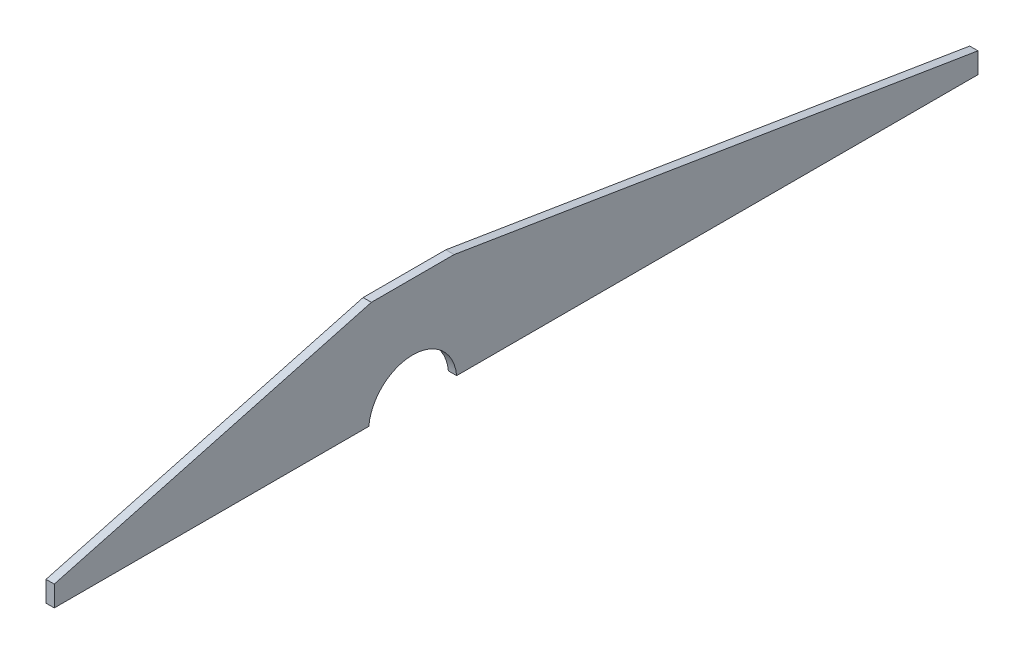
ISO-10303-21;
HEADER;
FILE_DESCRIPTION(('STEP AP214'),'2;1');
FILE_NAME('part.step','',(''),(''),'','','');
FILE_SCHEMA(('AUTOMOTIVE_DESIGN { 1 0 10303 214 1 1 1 1 }'));
ENDSEC;
DATA;
#1=APPLICATION_CONTEXT('core data for automotive mechanical design processes');
#2=APPLICATION_PROTOCOL_DEFINITION('international standard','automotive_design',2000,#1);
#3=PRODUCT_CONTEXT('',#1,'mechanical');
#4=PRODUCT('Part','Part','',(#3));
#5=PRODUCT_RELATED_PRODUCT_CATEGORY('part','',(#4));
#6=PRODUCT_DEFINITION_FORMATION('','',#4);
#7=PRODUCT_DEFINITION_CONTEXT('part definition',#1,'design');
#8=PRODUCT_DEFINITION('design','',#6,#7);
#9=PRODUCT_DEFINITION_SHAPE('','',#8);
#10=(LENGTH_UNIT() NAMED_UNIT(*) SI_UNIT(.MILLI.,.METRE.));
#11=(NAMED_UNIT(*) PLANE_ANGLE_UNIT() SI_UNIT($,.RADIAN.));
#12=(NAMED_UNIT(*) SI_UNIT($,.STERADIAN.) SOLID_ANGLE_UNIT());
#13=UNCERTAINTY_MEASURE_WITH_UNIT(LENGTH_MEASURE(1.E-05),#10,'distance_accuracy_value','');
#14=(GEOMETRIC_REPRESENTATION_CONTEXT(3) GLOBAL_UNCERTAINTY_ASSIGNED_CONTEXT((#13)) GLOBAL_UNIT_ASSIGNED_CONTEXT((#10,
#11,#12)) REPRESENTATION_CONTEXT('',''));
#15=CARTESIAN_POINT('',(0.,0.,0.));
#16=DIRECTION('',(0.,0.,1.));
#17=DIRECTION('',(1.,0.,0.));
#18=AXIS2_PLACEMENT_3D('',#15,#16,#17);
#19=CARTESIAN_POINT('',(-6.00000000000001,1.11022302462516E-13,-3.33066907387547E-13));
#20=DIRECTION('',(1.,0.,0.));
#21=DIRECTION('',(0.,0.,-1.00000000000002));
#22=AXIS2_PLACEMENT_3D('',#19,#20,#21);
#23=CYLINDRICAL_SURFACE('',#22,32.);
#24=CARTESIAN_POINT('',(0.,0.,0.));
#25=DIRECTION('',(-1.,0.,0.));
#26=DIRECTION('',(0.,0.,-1.00000000000002));
#27=AXIS2_PLACEMENT_3D('',#24,#25,#26);
#28=CIRCLE('',#27,32.);
#29=CARTESIAN_POINT('',(5.55111512312578E-13,3.00000000000034,31.8590646441481));
#30=VERTEX_POINT('',#29);
#31=CARTESIAN_POINT('',(2.77555756156289E-13,3.00000000000034,-31.8590646441489));
#32=VERTEX_POINT('',#31);
#33=EDGE_CURVE('E129',#30,#32,#28,.T.);
#34=ORIENTED_EDGE('',*,*,#33,.F.);
#35=DIRECTION('',(1.,0.,0.));
#36=VECTOR('',#35,1.);
#37=CARTESIAN_POINT('',(-5.99999999999945,3.,31.859064644148));
#38=LINE('',#37,#36);
#39=CARTESIAN_POINT('',(-5.99999999999945,3.,31.859064644148));
#40=VERTEX_POINT('',#39);
#41=EDGE_CURVE('E11',#40,#30,#38,.T.);
#42=ORIENTED_EDGE('',*,*,#41,.F.);
#43=CARTESIAN_POINT('',(-6.00000000000001,1.11022302462516E-13,-3.33066907387547E-13));
#44=DIRECTION('',(-1.,0.,0.));
#45=DIRECTION('',(0.,0.,-1.00000000000002));
#46=AXIS2_PLACEMENT_3D('',#43,#44,#45);
#47=CIRCLE('',#46,32.);
#48=CARTESIAN_POINT('',(-5.99999999999973,3.00000000000017,-31.859064644149));
#49=VERTEX_POINT('',#48);
#50=EDGE_CURVE('E149',#40,#49,#47,.T.);
#51=ORIENTED_EDGE('',*,*,#50,.T.);
#52=DIRECTION('',(1.,0.,0.));
#53=VECTOR('',#52,1.);
#54=CARTESIAN_POINT('',(-5.99999999999973,3.00000000000017,-31.859064644149));
#55=LINE('',#54,#53);
#56=EDGE_CURVE('E35',#49,#32,#55,.T.);
#57=ORIENTED_EDGE('',*,*,#56,.T.);
#58=EDGE_LOOP('',(#34,#42,#51,#57));
#59=FACE_BOUND('',#58,.T.);
#60=ADVANCED_FACE('F32',(#59),#23,.F.);
#61=CARTESIAN_POINT('',(-5.99999999999945,3.,31.859064644148));
#62=DIRECTION('',(0.,-1.00000000000002,0.));
#63=DIRECTION('',(0.,0.,-1.00000000000002));
#64=AXIS2_PLACEMENT_3D('',#61,#62,#63);
#65=PLANE('',#64);
#66=DIRECTION('',(0.,0.,-1.00000000000002));
#67=VECTOR('',#66,1.);
#68=CARTESIAN_POINT('',(5.55111512312578E-13,3.00000000000034,31.8590646441481));
#69=LINE('',#68,#67);
#70=CARTESIAN_POINT('',(2.77555756156289E-13,2.99999999999978,260.000000000004));
#71=VERTEX_POINT('',#70);
#72=EDGE_CURVE('E147',#71,#30,#69,.T.);
#73=ORIENTED_EDGE('',*,*,#72,.F.);
#74=DIRECTION('',(1.,0.,0.));
#75=VECTOR('',#74,1.);
#76=CARTESIAN_POINT('',(-5.99999999999973,3.00000000000056,260.000000000004));
#77=LINE('',#76,#75);
#78=CARTESIAN_POINT('',(-5.99999999999973,3.00000000000056,260.000000000004));
#79=VERTEX_POINT('',#78);
#80=EDGE_CURVE('E41',#79,#71,#77,.T.);
#81=ORIENTED_EDGE('',*,*,#80,.F.);
#82=DIRECTION('',(0.,0.,-1.00000000000002));
#83=VECTOR('',#82,1.);
#84=CARTESIAN_POINT('',(-5.99999999999945,3.,31.859064644148));
#85=LINE('',#84,#83);
#86=EDGE_CURVE('E119',#79,#40,#85,.T.);
#87=ORIENTED_EDGE('',*,*,#86,.T.);
#88=ORIENTED_EDGE('',*,*,#41,.T.);
#89=EDGE_LOOP('',(#73,#81,#87,#88));
#90=FACE_BOUND('',#89,.T.);
#91=ADVANCED_FACE('F161',(#90),#65,.T.);
#92=CARTESIAN_POINT('',(-5.99999999999973,3.00000000000056,260.000000000004));
#93=DIRECTION('',(0.,0.,1.00000000000002));
#94=DIRECTION('',(1.,0.,0.));
#95=AXIS2_PLACEMENT_3D('',#92,#93,#94);
#96=PLANE('',#95);
#97=DIRECTION('',(0.,-1.00000000000002,0.));
#98=VECTOR('',#97,1.);
#99=CARTESIAN_POINT('',(2.77555756156289E-13,2.99999999999978,260.000000000004));
#100=LINE('',#99,#98);
#101=CARTESIAN_POINT('',(2.77555756156289E-13,18.0000000000003,260.000000000004));
#102=VERTEX_POINT('',#101);
#103=EDGE_CURVE('E106',#102,#71,#100,.T.);
#104=ORIENTED_EDGE('',*,*,#103,.F.);
#105=DIRECTION('',(1.,0.,0.));
#106=VECTOR('',#105,1.);
#107=CARTESIAN_POINT('',(-5.99999999999973,18.0000000000003,260.000000000004));
#108=LINE('',#107,#106);
#109=CARTESIAN_POINT('',(-5.99999999999973,18.0000000000003,260.000000000004));
#110=VERTEX_POINT('',#109);
#111=EDGE_CURVE('E101',#110,#102,#108,.T.);
#112=ORIENTED_EDGE('',*,*,#111,.F.);
#113=DIRECTION('',(0.,-1.00000000000002,0.));
#114=VECTOR('',#113,1.);
#115=CARTESIAN_POINT('',(-5.99999999999973,3.00000000000056,260.000000000004));
#116=LINE('',#115,#114);
#117=EDGE_CURVE('E104',#110,#79,#116,.T.);
#118=ORIENTED_EDGE('',*,*,#117,.T.);
#119=ORIENTED_EDGE('',*,*,#80,.T.);
#120=EDGE_LOOP('',(#104,#112,#118,#119));
#121=FACE_BOUND('',#120,.T.);
#122=ADVANCED_FACE('F103',(#121),#96,.T.);
#123=CARTESIAN_POINT('',(-5.99999999999973,18.0000000000003,260.000000000004));
#124=DIRECTION('',(0.,0.965534647198912,0.260274557071011));
#125=DIRECTION('',(0.,-0.260274557071011,0.965534647198912));
#126=AXIS2_PLACEMENT_3D('',#123,#124,#125);
#127=PLANE('',#126);
#128=DIRECTION('',(0.,-0.260274557071011,0.965534647198911));
#129=VECTOR('',#128,1.);
#130=CARTESIAN_POINT('',(2.77555756156289E-13,18.0000000000003,260.000000000004));
#131=LINE('',#130,#129);
#132=CARTESIAN_POINT('',(2.77555756156289E-13,80.0000000000016,30.0000000000001));
#133=VERTEX_POINT('',#132);
#134=EDGE_CURVE('E144',#133,#102,#131,.T.);
#135=ORIENTED_EDGE('',*,*,#134,.F.);
#136=DIRECTION('',(1.,0.,0.));
#137=VECTOR('',#136,1.);
#138=CARTESIAN_POINT('',(-5.99999999999973,80.0000000000019,30.0000000000001));
#139=LINE('',#138,#137);
#140=CARTESIAN_POINT('',(-5.99999999999973,80.0000000000019,30.0000000000001));
#141=VERTEX_POINT('',#140);
#142=EDGE_CURVE('E111',#141,#133,#139,.T.);
#143=ORIENTED_EDGE('',*,*,#142,.F.);
#144=DIRECTION('',(0.,-0.260274557071011,0.965534647198911));
#145=VECTOR('',#144,1.);
#146=CARTESIAN_POINT('',(-5.99999999999973,18.0000000000003,260.000000000004));
#147=LINE('',#146,#145);
#148=EDGE_CURVE('E117',#141,#110,#147,.T.);
#149=ORIENTED_EDGE('',*,*,#148,.T.);
#150=ORIENTED_EDGE('',*,*,#111,.T.);
#151=EDGE_LOOP('',(#135,#143,#149,#150));
#152=FACE_BOUND('',#151,.T.);
#153=ADVANCED_FACE('F121',(#152),#127,.T.);
#154=CARTESIAN_POINT('',(-5.99999999999973,80.0000000000019,30.0000000000001));
#155=DIRECTION('',(0.,1.00000000000002,0.));
#156=DIRECTION('',(0.,0.,1.00000000000002));
#157=AXIS2_PLACEMENT_3D('',#154,#155,#156);
#158=PLANE('',#157);
#159=DIRECTION('',(0.,0.,1.00000000000002));
#160=VECTOR('',#159,1.);
#161=CARTESIAN_POINT('',(2.77555756156289E-13,80.0000000000016,30.0000000000001));
#162=LINE('',#161,#160);
#163=CARTESIAN_POINT('',(0.,80.0000000000016,-30.0000000000008));
#164=VERTEX_POINT('',#163);
#165=EDGE_CURVE('E141',#164,#133,#162,.T.);
#166=ORIENTED_EDGE('',*,*,#165,.F.);
#167=DIRECTION('',(1.,0.,0.));
#168=VECTOR('',#167,1.);
#169=CARTESIAN_POINT('',(-6.00000000000001,80.0000000000018,-30.0000000000009));
#170=LINE('',#169,#168);
#171=CARTESIAN_POINT('',(-6.00000000000001,80.0000000000018,-30.0000000000009));
#172=VERTEX_POINT('',#171);
#173=EDGE_CURVE('E153',#172,#164,#170,.T.);
#174=ORIENTED_EDGE('',*,*,#173,.F.);
#175=DIRECTION('',(0.,0.,1.00000000000002));
#176=VECTOR('',#175,1.);
#177=CARTESIAN_POINT('',(-5.99999999999973,80.0000000000019,30.0000000000001));
#178=LINE('',#177,#176);
#179=EDGE_CURVE('E122',#172,#141,#178,.T.);
#180=ORIENTED_EDGE('',*,*,#179,.T.);
#181=ORIENTED_EDGE('',*,*,#142,.T.);
#182=EDGE_LOOP('',(#166,#174,#180,#181));
#183=FACE_BOUND('',#182,.T.);
#184=ADVANCED_FACE('F174',(#183),#158,.T.);
#185=CARTESIAN_POINT('',(-6.00000000000001,80.0000000000018,-30.0000000000009));
#186=DIRECTION('',(0.,0.986949733701981,-0.161028640761901));
#187=DIRECTION('',(0.,0.161028640761901,0.98694973370198));
#188=AXIS2_PLACEMENT_3D('',#185,#186,#187);
#189=PLANE('',#188);
#190=DIRECTION('',(0.,0.161028640761902,0.986949733701981));
#191=VECTOR('',#190,1.);
#192=CARTESIAN_POINT('',(0.,80.0000000000016,-30.0000000000008));
#193=LINE('',#192,#191);
#194=CARTESIAN_POINT('',(0.,18.0000000000007,-410.000000000008));
#195=VERTEX_POINT('',#194);
#196=EDGE_CURVE('E138',#195,#164,#193,.T.);
#197=ORIENTED_EDGE('',*,*,#196,.F.);
#198=DIRECTION('',(1.,0.,0.));
#199=VECTOR('',#198,1.);
#200=CARTESIAN_POINT('',(-5.99999999999981,18.0000000000001,-410.000000000008));
#201=LINE('',#200,#199);
#202=CARTESIAN_POINT('',(-5.99999999999981,18.0000000000001,-410.000000000008));
#203=VERTEX_POINT('',#202);
#204=EDGE_CURVE('E155',#203,#195,#201,.T.);
#205=ORIENTED_EDGE('',*,*,#204,.F.);
#206=DIRECTION('',(0.,0.161028640761902,0.986949733701981));
#207=VECTOR('',#206,1.);
#208=CARTESIAN_POINT('',(-6.00000000000001,80.0000000000018,-30.0000000000009));
#209=LINE('',#208,#207);
#210=EDGE_CURVE('E124',#203,#172,#209,.T.);
#211=ORIENTED_EDGE('',*,*,#210,.T.);
#212=ORIENTED_EDGE('',*,*,#173,.T.);
#213=EDGE_LOOP('',(#197,#205,#211,#212));
#214=FACE_BOUND('',#213,.T.);
#215=ADVANCED_FACE('F177',(#214),#189,.T.);
#216=CARTESIAN_POINT('',(-5.99999999999981,18.0000000000001,-410.000000000008));
#217=DIRECTION('',(0.,0.,-1.00000000000002));
#218=DIRECTION('',(0.,1.00000000000002,0.));
#219=AXIS2_PLACEMENT_3D('',#216,#217,#218);
#220=PLANE('',#219);
#221=DIRECTION('',(0.,1.00000000000002,0.));
#222=VECTOR('',#221,1.);
#223=CARTESIAN_POINT('',(0.,18.0000000000007,-410.000000000008));
#224=LINE('',#223,#222);
#225=CARTESIAN_POINT('',(-2.77555756156289E-13,3.00000000000034,-410.000000000008));
#226=VERTEX_POINT('',#225);
#227=EDGE_CURVE('E135',#226,#195,#224,.T.);
#228=ORIENTED_EDGE('',*,*,#227,.F.);
#229=DIRECTION('',(1.,0.,0.));
#230=VECTOR('',#229,1.);
#231=CARTESIAN_POINT('',(-6.00000000000025,3.00000000000034,-410.000000000008));
#232=LINE('',#231,#230);
#233=CARTESIAN_POINT('',(-6.00000000000025,3.00000000000034,-410.000000000008));
#234=VERTEX_POINT('',#233);
#235=EDGE_CURVE('E156',#234,#226,#232,.T.);
#236=ORIENTED_EDGE('',*,*,#235,.F.);
#237=DIRECTION('',(0.,1.00000000000002,0.));
#238=VECTOR('',#237,1.);
#239=CARTESIAN_POINT('',(-5.99999999999981,18.0000000000001,-410.000000000008));
#240=LINE('',#239,#238);
#241=EDGE_CURVE('E252',#234,#203,#240,.T.);
#242=ORIENTED_EDGE('',*,*,#241,.T.);
#243=ORIENTED_EDGE('',*,*,#204,.T.);
#244=EDGE_LOOP('',(#228,#236,#242,#243));
#245=FACE_BOUND('',#244,.T.);
#246=ADVANCED_FACE('F181',(#245),#220,.T.);
#247=CARTESIAN_POINT('',(-6.00000000000025,3.00000000000034,-410.000000000008));
#248=DIRECTION('',(0.,-1.00000000000002,0.));
#249=DIRECTION('',(0.,0.,-1.00000000000002));
#250=AXIS2_PLACEMENT_3D('',#247,#248,#249);
#251=PLANE('',#250);
#252=DIRECTION('',(0.,0.,-1.00000000000002));
#253=VECTOR('',#252,1.);
#254=CARTESIAN_POINT('',(-2.77555756156289E-13,3.00000000000034,-410.000000000008));
#255=LINE('',#254,#253);
#256=EDGE_CURVE('E132',#32,#226,#255,.T.);
#257=ORIENTED_EDGE('',*,*,#256,.F.);
#258=ORIENTED_EDGE('',*,*,#56,.F.);
#259=DIRECTION('',(0.,0.,-1.00000000000002));
#260=VECTOR('',#259,1.);
#261=CARTESIAN_POINT('',(-6.00000000000025,3.00000000000034,-410.000000000008));
#262=LINE('',#261,#260);
#263=EDGE_CURVE('E253',#49,#234,#262,.T.);
#264=ORIENTED_EDGE('',*,*,#263,.T.);
#265=ORIENTED_EDGE('',*,*,#235,.T.);
#266=EDGE_LOOP('',(#257,#258,#264,#265));
#267=FACE_BOUND('',#266,.T.);
#268=ADVANCED_FACE('F158',(#267),#251,.T.);
#269=CARTESIAN_POINT('',(-6.00000000000001,1.11022302462516E-13,-3.33066907387547E-13));
#270=DIRECTION('',(1.,0.,0.));
#271=DIRECTION('',(0.,0.,-1.00000000000002));
#272=AXIS2_PLACEMENT_3D('',#269,#270,#271);
#273=PLANE('',#272);
#274=ORIENTED_EDGE('',*,*,#50,.F.);
#275=ORIENTED_EDGE('',*,*,#86,.F.);
#276=ORIENTED_EDGE('',*,*,#117,.F.);
#277=ORIENTED_EDGE('',*,*,#148,.F.);
#278=ORIENTED_EDGE('',*,*,#179,.F.);
#279=ORIENTED_EDGE('',*,*,#210,.F.);
#280=ORIENTED_EDGE('',*,*,#241,.F.);
#281=ORIENTED_EDGE('',*,*,#263,.F.);
#282=EDGE_LOOP('',(#274,#275,#276,#277,#278,#279,#280,#281));
#283=FACE_BOUND('',#282,.T.);
#284=ADVANCED_FACE('F115',(#283),#273,.F.);
#285=CARTESIAN_POINT('',(0.,0.,0.));
#286=DIRECTION('',(1.,0.,0.));
#287=DIRECTION('',(0.,0.,-1.00000000000002));
#288=AXIS2_PLACEMENT_3D('',#285,#286,#287);
#289=PLANE('',#288);
#290=ORIENTED_EDGE('',*,*,#33,.T.);
#291=ORIENTED_EDGE('',*,*,#256,.T.);
#292=ORIENTED_EDGE('',*,*,#227,.T.);
#293=ORIENTED_EDGE('',*,*,#196,.T.);
#294=ORIENTED_EDGE('',*,*,#165,.T.);
#295=ORIENTED_EDGE('',*,*,#134,.T.);
#296=ORIENTED_EDGE('',*,*,#103,.T.);
#297=ORIENTED_EDGE('',*,*,#72,.T.);
#298=EDGE_LOOP('',(#290,#291,#292,#293,#294,#295,#296,#297));
#299=FACE_BOUND('',#298,.T.);
#300=ADVANCED_FACE('F160',(#299),#289,.T.);
#301=CLOSED_SHELL('',(#60,#91,#122,#153,#184,#215,#246,#268,#284,#300));
#302=MANIFOLD_SOLID_BREP('B2',#301);
#303=ADVANCED_BREP_SHAPE_REPRESENTATION('',(#18,#302),#14);
#304=SHAPE_DEFINITION_REPRESENTATION(#9,#303);
ENDSEC;
END-ISO-10303-21;
